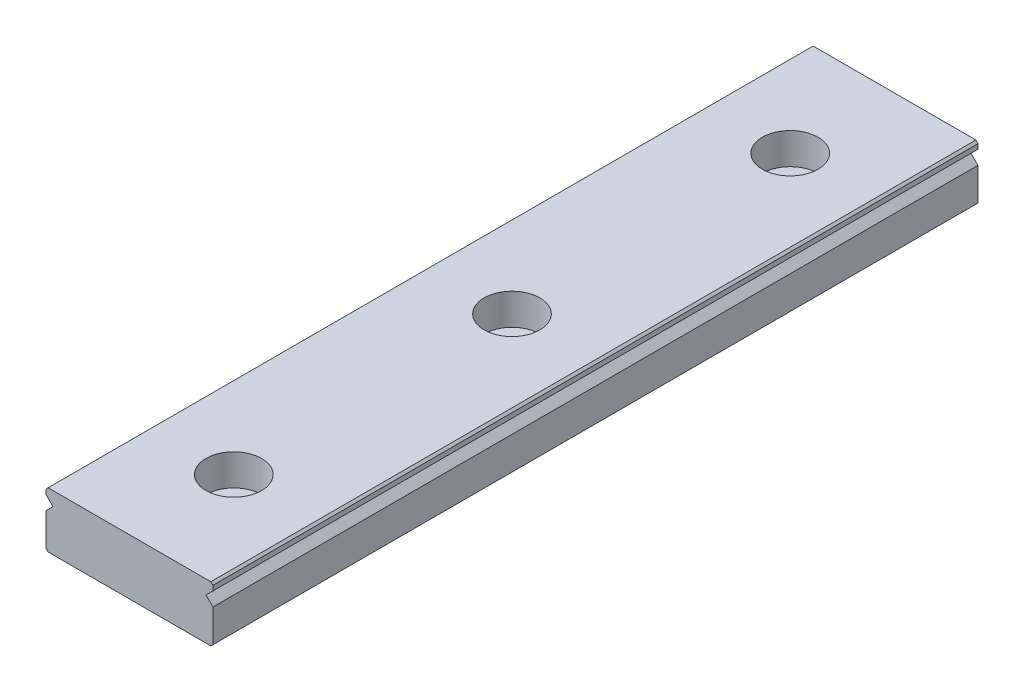
ISO-10303-21;
HEADER;
FILE_DESCRIPTION(('STEP AP214'),'2;1');
FILE_NAME('part.step','',(''),(''),'','','');
FILE_SCHEMA(('AUTOMOTIVE_DESIGN { 1 0 10303 214 1 1 1 1 }'));
ENDSEC;
DATA;
#1=APPLICATION_CONTEXT('core data for automotive mechanical design processes');
#2=APPLICATION_PROTOCOL_DEFINITION('international standard','automotive_design',2000,#1);
#3=PRODUCT_CONTEXT('',#1,'mechanical');
#4=PRODUCT('Part','Part','',(#3));
#5=PRODUCT_RELATED_PRODUCT_CATEGORY('part','',(#4));
#6=PRODUCT_DEFINITION_FORMATION('','',#4);
#7=PRODUCT_DEFINITION_CONTEXT('part definition',#1,'design');
#8=PRODUCT_DEFINITION('design','',#6,#7);
#9=PRODUCT_DEFINITION_SHAPE('','',#8);
#10=(LENGTH_UNIT() NAMED_UNIT(*) SI_UNIT(.MILLI.,.METRE.));
#11=(NAMED_UNIT(*) PLANE_ANGLE_UNIT() SI_UNIT($,.RADIAN.));
#12=(NAMED_UNIT(*) SI_UNIT($,.STERADIAN.) SOLID_ANGLE_UNIT());
#13=UNCERTAINTY_MEASURE_WITH_UNIT(LENGTH_MEASURE(1.E-05),#10,'distance_accuracy_value','');
#14=(GEOMETRIC_REPRESENTATION_CONTEXT(3) GLOBAL_UNCERTAINTY_ASSIGNED_CONTEXT((#13)) GLOBAL_UNIT_ASSIGNED_CONTEXT((#10,
#11,#12)) REPRESENTATION_CONTEXT('',''));
#15=CARTESIAN_POINT('',(0.,0.,0.));
#16=DIRECTION('',(0.,0.,1.));
#17=DIRECTION('',(1.,0.,0.));
#18=AXIS2_PLACEMENT_3D('',#15,#16,#17);
#19=CARTESIAN_POINT('',(12.,7.,110.));
#20=DIRECTION('',(-1.,0.,0.));
#21=DIRECTION('',(0.,0.,1.));
#22=AXIS2_PLACEMENT_3D('',#19,#20,#21);
#23=PLANE('',#22);
#24=DIRECTION('',(0.,0.,1.));
#25=VECTOR('',#24,1.);
#26=CARTESIAN_POINT('',(12.,7.7,110.));
#27=LINE('',#26,#25);
#28=CARTESIAN_POINT('',(12.,7.7,0.));
#29=VERTEX_POINT('',#28);
#30=CARTESIAN_POINT('',(12.,7.7,110.));
#31=VERTEX_POINT('',#30);
#32=EDGE_CURVE('E122',#29,#31,#27,.T.);
#33=ORIENTED_EDGE('',*,*,#32,.T.);
#34=DIRECTION('',(0.,1.,0.));
#35=VECTOR('',#34,1.);
#36=CARTESIAN_POINT('',(12.,7.,110.));
#37=LINE('',#36,#35);
#38=CARTESIAN_POINT('',(12.,7.,110.));
#39=VERTEX_POINT('',#38);
#40=EDGE_CURVE('E118',#39,#31,#37,.T.);
#41=ORIENTED_EDGE('',*,*,#40,.F.);
#42=DIRECTION('',(0.,0.,1.));
#43=VECTOR('',#42,1.);
#44=CARTESIAN_POINT('',(12.,7.,110.));
#45=LINE('',#44,#43);
#46=CARTESIAN_POINT('',(12.,7.,0.));
#47=VERTEX_POINT('',#46);
#48=EDGE_CURVE('E120',#39,#47,#45,.F.);
#49=ORIENTED_EDGE('',*,*,#48,.T.);
#50=DIRECTION('',(0.,1.,0.));
#51=VECTOR('',#50,1.);
#52=CARTESIAN_POINT('',(12.,7.,0.));
#53=LINE('',#52,#51);
#54=EDGE_CURVE('E112',#29,#47,#53,.F.);
#55=ORIENTED_EDGE('',*,*,#54,.F.);
#56=EDGE_LOOP('',(#33,#41,#49,#55));
#57=FACE_BOUND('',#56,.T.);
#58=ADVANCED_FACE('F17',(#57),#23,.F.);
#59=CARTESIAN_POINT('',(-12.,7.,110.));
#60=DIRECTION('',(1.,0.,0.));
#61=DIRECTION('',(0.,0.,-1.));
#62=AXIS2_PLACEMENT_3D('',#59,#60,#61);
#63=PLANE('',#62);
#64=DIRECTION('',(0.,0.,1.));
#65=VECTOR('',#64,1.);
#66=CARTESIAN_POINT('',(-12.,7.,110.));
#67=LINE('',#66,#65);
#68=CARTESIAN_POINT('',(-12.,7.,0.));
#69=VERTEX_POINT('',#68);
#70=CARTESIAN_POINT('',(-12.,7.,110.));
#71=VERTEX_POINT('',#70);
#72=EDGE_CURVE('E222',#69,#71,#67,.T.);
#73=ORIENTED_EDGE('',*,*,#72,.T.);
#74=DIRECTION('',(0.,1.,0.));
#75=VECTOR('',#74,1.);
#76=CARTESIAN_POINT('',(-12.,7.,110.));
#77=LINE('',#76,#75);
#78=CARTESIAN_POINT('',(-12.,7.7,110.));
#79=VERTEX_POINT('',#78);
#80=EDGE_CURVE('E140',#79,#71,#77,.F.);
#81=ORIENTED_EDGE('',*,*,#80,.F.);
#82=DIRECTION('',(0.,0.,1.));
#83=VECTOR('',#82,1.);
#84=CARTESIAN_POINT('',(-12.,7.7,110.));
#85=LINE('',#84,#83);
#86=CARTESIAN_POINT('',(-12.,7.7,0.));
#87=VERTEX_POINT('',#86);
#88=EDGE_CURVE('E207',#79,#87,#85,.F.);
#89=ORIENTED_EDGE('',*,*,#88,.T.);
#90=DIRECTION('',(0.,1.,0.));
#91=VECTOR('',#90,1.);
#92=CARTESIAN_POINT('',(-12.,7.,0.));
#93=LINE('',#92,#91);
#94=EDGE_CURVE('E138',#69,#87,#93,.T.);
#95=ORIENTED_EDGE('',*,*,#94,.F.);
#96=EDGE_LOOP('',(#73,#81,#89,#95));
#97=FACE_BOUND('',#96,.T.);
#98=ADVANCED_FACE('F282',(#97),#63,.F.);
#99=CARTESIAN_POINT('',(12.,7.,110.));
#100=DIRECTION('',(-0.707106781186548,0.707106781186547,0.));
#101=DIRECTION('',(-0.707106781186547,-0.707106781186548,0.));
#102=AXIS2_PLACEMENT_3D('',#99,#100,#101);
#103=PLANE('',#102);
#104=ORIENTED_EDGE('',*,*,#48,.F.);
#105=DIRECTION('',(-0.707106781186547,-0.707106781186548,0.));
#106=VECTOR('',#105,1.);
#107=CARTESIAN_POINT('',(12.,7.,110.));
#108=LINE('',#107,#106);
#109=CARTESIAN_POINT('',(11.,6.,110.));
#110=VERTEX_POINT('',#109);
#111=EDGE_CURVE('E130',#110,#39,#108,.F.);
#112=ORIENTED_EDGE('',*,*,#111,.F.);
#113=DIRECTION('',(0.,0.,1.));
#114=VECTOR('',#113,1.);
#115=CARTESIAN_POINT('',(11.,6.,110.));
#116=LINE('',#115,#114);
#117=CARTESIAN_POINT('',(11.,6.,0.));
#118=VERTEX_POINT('',#117);
#119=EDGE_CURVE('E202',#110,#118,#116,.F.);
#120=ORIENTED_EDGE('',*,*,#119,.T.);
#121=DIRECTION('',(-0.707106781186547,-0.707106781186548,0.));
#122=VECTOR('',#121,1.);
#123=CARTESIAN_POINT('',(12.,7.,0.));
#124=LINE('',#123,#122);
#125=EDGE_CURVE('E132',#47,#118,#124,.T.);
#126=ORIENTED_EDGE('',*,*,#125,.F.);
#127=EDGE_LOOP('',(#104,#112,#120,#126));
#128=FACE_BOUND('',#127,.T.);
#129=ADVANCED_FACE('F128',(#128),#103,.F.);
#130=CARTESIAN_POINT('',(-12.,7.,110.));
#131=DIRECTION('',(0.707106781186548,0.707106781186548,0.));
#132=DIRECTION('',(-0.707106781186548,0.707106781186548,0.));
#133=AXIS2_PLACEMENT_3D('',#130,#131,#132);
#134=PLANE('',#133);
#135=DIRECTION('',(0.,0.,1.));
#136=VECTOR('',#135,1.);
#137=CARTESIAN_POINT('',(-11.,6.,110.));
#138=LINE('',#137,#136);
#139=CARTESIAN_POINT('',(-11.,6.,0.));
#140=VERTEX_POINT('',#139);
#141=CARTESIAN_POINT('',(-11.,6.,110.));
#142=VERTEX_POINT('',#141);
#143=EDGE_CURVE('E193',#140,#142,#138,.T.);
#144=ORIENTED_EDGE('',*,*,#143,.T.);
#145=DIRECTION('',(-0.707106781186548,0.707106781186548,0.));
#146=VECTOR('',#145,1.);
#147=CARTESIAN_POINT('',(-12.,7.,110.));
#148=LINE('',#147,#146);
#149=EDGE_CURVE('E220',#71,#142,#148,.F.);
#150=ORIENTED_EDGE('',*,*,#149,.F.);
#151=ORIENTED_EDGE('',*,*,#72,.F.);
#152=DIRECTION('',(-0.707106781186548,0.707106781186548,0.));
#153=VECTOR('',#152,1.);
#154=CARTESIAN_POINT('',(-12.,7.,0.));
#155=LINE('',#154,#153);
#156=EDGE_CURVE('E218',#140,#69,#155,.T.);
#157=ORIENTED_EDGE('',*,*,#156,.F.);
#158=EDGE_LOOP('',(#144,#150,#151,#157));
#159=FACE_BOUND('',#158,.T.);
#160=ADVANCED_FACE('F285',(#159),#134,.F.);
#161=CARTESIAN_POINT('',(0.,8.,15.));
#162=DIRECTION('',(0.,1.,0.));
#163=DIRECTION('',(0.,0.,1.));
#164=AXIS2_PLACEMENT_3D('',#161,#162,#163);
#165=CYLINDRICAL_SURFACE('',#164,4.);
#166=CARTESIAN_POINT('',(0.,3.5,15.));
#167=DIRECTION('',(0.,1.,0.));
#168=DIRECTION('',(0.,0.,1.));
#169=AXIS2_PLACEMENT_3D('',#166,#167,#168);
#170=CIRCLE('',#169,4.);
#171=CARTESIAN_POINT('',(0.,3.5,19.));
#172=VERTEX_POINT('',#171);
#173=EDGE_CURVE('E20',#172,#172,#170,.F.);
#174=ORIENTED_EDGE('',*,*,#173,.T.);
#175=EDGE_LOOP('',(#174));
#176=FACE_BOUND('',#175,.T.);
#177=CARTESIAN_POINT('',(0.,8.,15.));
#178=DIRECTION('',(0.,1.,0.));
#179=DIRECTION('',(0.,0.,1.));
#180=AXIS2_PLACEMENT_3D('',#177,#178,#179);
#181=CIRCLE('',#180,4.);
#182=CARTESIAN_POINT('',(0.,8.,19.));
#183=VERTEX_POINT('',#182);
#184=EDGE_CURVE('E175',#183,#183,#181,.T.);
#185=ORIENTED_EDGE('',*,*,#184,.T.);
#186=EDGE_LOOP('',(#185));
#187=FACE_BOUND('',#186,.T.);
#188=ADVANCED_FACE('F490',(#176,#187),#165,.F.);
#189=CARTESIAN_POINT('',(1.39659334444375E-13,8.,55.));
#190=DIRECTION('',(0.,1.,0.));
#191=DIRECTION('',(0.,0.,1.));
#192=AXIS2_PLACEMENT_3D('',#189,#190,#191);
#193=CYLINDRICAL_SURFACE('',#192,4.);
#194=CARTESIAN_POINT('',(1.39659334444375E-13,3.5,55.));
#195=DIRECTION('',(0.,1.,0.));
#196=DIRECTION('',(0.,0.,1.));
#197=AXIS2_PLACEMENT_3D('',#194,#195,#196);
#198=CIRCLE('',#197,4.);
#199=CARTESIAN_POINT('',(1.39659334444375E-13,3.5,59.));
#200=VERTEX_POINT('',#199);
#201=EDGE_CURVE('E180',#200,#200,#198,.F.);
#202=ORIENTED_EDGE('',*,*,#201,.T.);
#203=EDGE_LOOP('',(#202));
#204=FACE_BOUND('',#203,.T.);
#205=CARTESIAN_POINT('',(1.39659334444375E-13,8.,55.));
#206=DIRECTION('',(0.,1.,0.));
#207=DIRECTION('',(0.,0.,1.));
#208=AXIS2_PLACEMENT_3D('',#205,#206,#207);
#209=CIRCLE('',#208,4.);
#210=CARTESIAN_POINT('',(1.39659334444375E-13,8.,59.));
#211=VERTEX_POINT('',#210);
#212=EDGE_CURVE('E172',#211,#211,#209,.T.);
#213=ORIENTED_EDGE('',*,*,#212,.T.);
#214=EDGE_LOOP('',(#213));
#215=FACE_BOUND('',#214,.T.);
#216=ADVANCED_FACE('F480',(#204,#215),#193,.F.);
#217=CARTESIAN_POINT('',(2.79318668888751E-13,8.,95.));
#218=DIRECTION('',(0.,1.,0.));
#219=DIRECTION('',(0.,0.,1.));
#220=AXIS2_PLACEMENT_3D('',#217,#218,#219);
#221=CYLINDRICAL_SURFACE('',#220,4.);
#222=CARTESIAN_POINT('',(2.79318668888751E-13,3.5,95.));
#223=DIRECTION('',(0.,1.,0.));
#224=DIRECTION('',(0.,0.,1.));
#225=AXIS2_PLACEMENT_3D('',#222,#223,#224);
#226=CIRCLE('',#225,4.);
#227=CARTESIAN_POINT('',(2.79318668888751E-13,3.5,99.));
#228=VERTEX_POINT('',#227);
#229=EDGE_CURVE('E178',#228,#228,#226,.F.);
#230=ORIENTED_EDGE('',*,*,#229,.T.);
#231=EDGE_LOOP('',(#230));
#232=FACE_BOUND('',#231,.T.);
#233=CARTESIAN_POINT('',(2.79318668888751E-13,8.,95.));
#234=DIRECTION('',(0.,1.,0.));
#235=DIRECTION('',(0.,0.,1.));
#236=AXIS2_PLACEMENT_3D('',#233,#234,#235);
#237=CIRCLE('',#236,4.);
#238=CARTESIAN_POINT('',(2.79318668888751E-13,8.,99.));
#239=VERTEX_POINT('',#238);
#240=EDGE_CURVE('E168',#239,#239,#237,.T.);
#241=ORIENTED_EDGE('',*,*,#240,.T.);
#242=EDGE_LOOP('',(#241));
#243=FACE_BOUND('',#242,.T.);
#244=ADVANCED_FACE('F471',(#232,#243),#221,.F.);
#245=CARTESIAN_POINT('',(11.7,8.,110.));
#246=DIRECTION('',(-0.707106781186548,-0.707106781186548,0.));
#247=DIRECTION('',(0.707106781186548,-0.707106781186548,0.));
#248=AXIS2_PLACEMENT_3D('',#245,#246,#247);
#249=PLANE('',#248);
#250=DIRECTION('',(0.,0.,-1.));
#251=VECTOR('',#250,1.);
#252=CARTESIAN_POINT('',(11.7,8.,110.));
#253=LINE('',#252,#251);
#254=CARTESIAN_POINT('',(11.7,8.,0.));
#255=VERTEX_POINT('',#254);
#256=CARTESIAN_POINT('',(11.7,8.,110.));
#257=VERTEX_POINT('',#256);
#258=EDGE_CURVE('E171',#255,#257,#253,.F.);
#259=ORIENTED_EDGE('',*,*,#258,.T.);
#260=DIRECTION('',(0.707106781186548,-0.707106781186548,0.));
#261=VECTOR('',#260,1.);
#262=CARTESIAN_POINT('',(11.7,8.,110.));
#263=LINE('',#262,#261);
#264=EDGE_CURVE('E215',#31,#257,#263,.F.);
#265=ORIENTED_EDGE('',*,*,#264,.F.);
#266=ORIENTED_EDGE('',*,*,#32,.F.);
#267=DIRECTION('',(0.707106781186548,-0.707106781186548,0.));
#268=VECTOR('',#267,1.);
#269=CARTESIAN_POINT('',(11.7,8.,0.));
#270=LINE('',#269,#268);
#271=EDGE_CURVE('E213',#255,#29,#270,.T.);
#272=ORIENTED_EDGE('',*,*,#271,.F.);
#273=EDGE_LOOP('',(#259,#265,#266,#272));
#274=FACE_BOUND('',#273,.T.);
#275=ADVANCED_FACE('F273',(#274),#249,.F.);
#276=CARTESIAN_POINT('',(-12.,7.7,110.));
#277=DIRECTION('',(0.707106781186548,-0.707106781186548,0.));
#278=DIRECTION('',(0.707106781186548,0.707106781186548,0.));
#279=AXIS2_PLACEMENT_3D('',#276,#277,#278);
#280=PLANE('',#279);
#281=ORIENTED_EDGE('',*,*,#88,.F.);
#282=DIRECTION('',(0.707106781186548,0.707106781186548,0.));
#283=VECTOR('',#282,1.);
#284=CARTESIAN_POINT('',(-12.,7.7,110.));
#285=LINE('',#284,#283);
#286=CARTESIAN_POINT('',(-11.7,8.,110.));
#287=VERTEX_POINT('',#286);
#288=EDGE_CURVE('E210',#287,#79,#285,.F.);
#289=ORIENTED_EDGE('',*,*,#288,.F.);
#290=DIRECTION('',(0.,0.,-1.));
#291=VECTOR('',#290,1.);
#292=CARTESIAN_POINT('',(-11.7,8.,110.));
#293=LINE('',#292,#291);
#294=CARTESIAN_POINT('',(-11.7,8.,0.));
#295=VERTEX_POINT('',#294);
#296=EDGE_CURVE('E233',#287,#295,#293,.T.);
#297=ORIENTED_EDGE('',*,*,#296,.T.);
#298=DIRECTION('',(0.707106781186548,0.707106781186548,0.));
#299=VECTOR('',#298,1.);
#300=CARTESIAN_POINT('',(-12.,7.7,0.));
#301=LINE('',#300,#299);
#302=EDGE_CURVE('E205',#87,#295,#301,.T.);
#303=ORIENTED_EDGE('',*,*,#302,.F.);
#304=EDGE_LOOP('',(#281,#289,#297,#303));
#305=FACE_BOUND('',#304,.T.);
#306=ADVANCED_FACE('F280',(#305),#280,.F.);
#307=CARTESIAN_POINT('',(11.,6.,110.));
#308=DIRECTION('',(-0.707106781186548,-0.707106781186548,0.));
#309=DIRECTION('',(0.707106781186548,-0.707106781186548,0.));
#310=AXIS2_PLACEMENT_3D('',#307,#308,#309);
#311=PLANE('',#310);
#312=ORIENTED_EDGE('',*,*,#119,.F.);
#313=DIRECTION('',(0.707106781186548,-0.707106781186548,0.));
#314=VECTOR('',#313,1.);
#315=CARTESIAN_POINT('',(11.,6.,110.));
#316=LINE('',#315,#314);
#317=CARTESIAN_POINT('',(12.,5.,110.));
#318=VERTEX_POINT('',#317);
#319=EDGE_CURVE('E137',#318,#110,#316,.F.);
#320=ORIENTED_EDGE('',*,*,#319,.F.);
#321=DIRECTION('',(0.,0.,1.));
#322=VECTOR('',#321,1.);
#323=CARTESIAN_POINT('',(12.,5.,110.));
#324=LINE('',#323,#322);
#325=CARTESIAN_POINT('',(12.,5.,0.));
#326=VERTEX_POINT('',#325);
#327=EDGE_CURVE('E230',#318,#326,#324,.F.);
#328=ORIENTED_EDGE('',*,*,#327,.T.);
#329=DIRECTION('',(0.707106781186548,-0.707106781186548,0.));
#330=VECTOR('',#329,1.);
#331=CARTESIAN_POINT('',(11.,6.,0.));
#332=LINE('',#331,#330);
#333=EDGE_CURVE('E200',#118,#326,#332,.T.);
#334=ORIENTED_EDGE('',*,*,#333,.F.);
#335=EDGE_LOOP('',(#312,#320,#328,#334));
#336=FACE_BOUND('',#335,.T.);
#337=ADVANCED_FACE('F228',(#336),#311,.F.);
#338=CARTESIAN_POINT('',(-11.,6.,110.));
#339=DIRECTION('',(0.707106781186548,-0.707106781186547,0.));
#340=DIRECTION('',(0.707106781186547,0.707106781186548,0.));
#341=AXIS2_PLACEMENT_3D('',#338,#339,#340);
#342=PLANE('',#341);
#343=DIRECTION('',(0.,0.,-1.));
#344=VECTOR('',#343,1.);
#345=CARTESIAN_POINT('',(-12.,5.,110.));
#346=LINE('',#345,#344);
#347=CARTESIAN_POINT('',(-12.,5.,0.));
#348=VERTEX_POINT('',#347);
#349=CARTESIAN_POINT('',(-12.,5.,110.));
#350=VERTEX_POINT('',#349);
#351=EDGE_CURVE('E167',#348,#350,#346,.F.);
#352=ORIENTED_EDGE('',*,*,#351,.T.);
#353=DIRECTION('',(0.707106781186547,0.707106781186548,0.));
#354=VECTOR('',#353,1.);
#355=CARTESIAN_POINT('',(-11.,6.,110.));
#356=LINE('',#355,#354);
#357=EDGE_CURVE('E189',#142,#350,#356,.F.);
#358=ORIENTED_EDGE('',*,*,#357,.F.);
#359=ORIENTED_EDGE('',*,*,#143,.F.);
#360=DIRECTION('',(0.707106781186547,0.707106781186548,0.));
#361=VECTOR('',#360,1.);
#362=CARTESIAN_POINT('',(-11.,6.,0.));
#363=LINE('',#362,#361);
#364=EDGE_CURVE('E185',#348,#140,#363,.T.);
#365=ORIENTED_EDGE('',*,*,#364,.F.);
#366=EDGE_LOOP('',(#352,#358,#359,#365));
#367=FACE_BOUND('',#366,.T.);
#368=ADVANCED_FACE('F290',(#367),#342,.F.);
#369=CARTESIAN_POINT('',(2.25,3.5,15.));
#370=DIRECTION('',(0.,-1.,0.));
#371=DIRECTION('',(0.,0.,-1.));
#372=AXIS2_PLACEMENT_3D('',#369,#370,#371);
#373=PLANE('',#372);
#374=ORIENTED_EDGE('',*,*,#173,.F.);
#375=EDGE_LOOP('',(#374));
#376=FACE_BOUND('',#375,.T.);
#377=CARTESIAN_POINT('',(0.,3.5,15.));
#378=DIRECTION('',(0.,1.,0.));
#379=DIRECTION('',(0.,0.,1.));
#380=AXIS2_PLACEMENT_3D('',#377,#378,#379);
#381=CIRCLE('',#380,2.25);
#382=CARTESIAN_POINT('',(0.,3.5,17.25));
#383=VERTEX_POINT('',#382);
#384=EDGE_CURVE('E164',#383,#383,#381,.F.);
#385=ORIENTED_EDGE('',*,*,#384,.T.);
#386=EDGE_LOOP('',(#385));
#387=FACE_BOUND('',#386,.T.);
#388=ADVANCED_FACE('F428',(#376,#387),#373,.F.);
#389=CARTESIAN_POINT('',(2.25000000000014,3.5,55.));
#390=DIRECTION('',(0.,-1.,0.));
#391=DIRECTION('',(0.,0.,-1.));
#392=AXIS2_PLACEMENT_3D('',#389,#390,#391);
#393=PLANE('',#392);
#394=ORIENTED_EDGE('',*,*,#201,.F.);
#395=EDGE_LOOP('',(#394));
#396=FACE_BOUND('',#395,.T.);
#397=CARTESIAN_POINT('',(1.39659334444375E-13,3.5,55.));
#398=DIRECTION('',(0.,1.,0.));
#399=DIRECTION('',(0.,0.,1.));
#400=AXIS2_PLACEMENT_3D('',#397,#398,#399);
#401=CIRCLE('',#400,2.25);
#402=CARTESIAN_POINT('',(1.39659334444375E-13,3.5,57.25));
#403=VERTEX_POINT('',#402);
#404=EDGE_CURVE('E161',#403,#403,#401,.F.);
#405=ORIENTED_EDGE('',*,*,#404,.T.);
#406=EDGE_LOOP('',(#405));
#407=FACE_BOUND('',#406,.T.);
#408=ADVANCED_FACE('F418',(#396,#407),#393,.F.);
#409=CARTESIAN_POINT('',(2.25000000000028,3.5,95.));
#410=DIRECTION('',(0.,-1.,0.));
#411=DIRECTION('',(0.,0.,-1.));
#412=AXIS2_PLACEMENT_3D('',#409,#410,#411);
#413=PLANE('',#412);
#414=ORIENTED_EDGE('',*,*,#229,.F.);
#415=EDGE_LOOP('',(#414));
#416=FACE_BOUND('',#415,.T.);
#417=CARTESIAN_POINT('',(2.79318668888751E-13,3.5,95.));
#418=DIRECTION('',(0.,1.,0.));
#419=DIRECTION('',(0.,0.,1.));
#420=AXIS2_PLACEMENT_3D('',#417,#418,#419);
#421=CIRCLE('',#420,2.25);
#422=CARTESIAN_POINT('',(2.79318668888751E-13,3.5,97.25));
#423=VERTEX_POINT('',#422);
#424=EDGE_CURVE('E157',#423,#423,#421,.F.);
#425=ORIENTED_EDGE('',*,*,#424,.T.);
#426=EDGE_LOOP('',(#425));
#427=FACE_BOUND('',#426,.T.);
#428=ADVANCED_FACE('F409',(#416,#427),#413,.F.);
#429=CARTESIAN_POINT('',(-11.7,8.,110.));
#430=DIRECTION('',(0.,-1.,0.));
#431=DIRECTION('',(0.,0.,-1.));
#432=AXIS2_PLACEMENT_3D('',#429,#430,#431);
#433=PLANE('',#432);
#434=ORIENTED_EDGE('',*,*,#296,.F.);
#435=DIRECTION('',(-1.,0.,0.));
#436=VECTOR('',#435,1.);
#437=CARTESIAN_POINT('',(-12.,8.,110.));
#438=LINE('',#437,#436);
#439=EDGE_CURVE('E260',#287,#257,#438,.F.);
#440=ORIENTED_EDGE('',*,*,#439,.T.);
#441=ORIENTED_EDGE('',*,*,#258,.F.);
#442=DIRECTION('',(-1.,0.,0.));
#443=VECTOR('',#442,1.);
#444=CARTESIAN_POINT('',(-12.,8.,0.));
#445=LINE('',#444,#443);
#446=EDGE_CURVE('E240',#295,#255,#445,.F.);
#447=ORIENTED_EDGE('',*,*,#446,.F.);
#448=EDGE_LOOP('',(#434,#440,#441,#447));
#449=FACE_BOUND('',#448,.T.);
#450=ORIENTED_EDGE('',*,*,#240,.F.);
#451=EDGE_LOOP('',(#450));
#452=FACE_BOUND('',#451,.T.);
#453=ORIENTED_EDGE('',*,*,#212,.F.);
#454=EDGE_LOOP('',(#453));
#455=FACE_BOUND('',#454,.T.);
#456=ORIENTED_EDGE('',*,*,#184,.F.);
#457=EDGE_LOOP('',(#456));
#458=FACE_BOUND('',#457,.T.);
#459=ADVANCED_FACE('F276',(#449,#452,#455,#458),#433,.F.);
#460=CARTESIAN_POINT('',(12.,0.3,110.));
#461=DIRECTION('',(-1.,0.,0.));
#462=DIRECTION('',(0.,0.,1.));
#463=AXIS2_PLACEMENT_3D('',#460,#461,#462);
#464=PLANE('',#463);
#465=ORIENTED_EDGE('',*,*,#327,.F.);
#466=DIRECTION('',(0.,1.,0.));
#467=VECTOR('',#466,1.);
#468=CARTESIAN_POINT('',(12.,8.,110.));
#469=LINE('',#468,#467);
#470=CARTESIAN_POINT('',(12.,0.3,110.));
#471=VERTEX_POINT('',#470);
#472=EDGE_CURVE('E258',#318,#471,#469,.F.);
#473=ORIENTED_EDGE('',*,*,#472,.T.);
#474=DIRECTION('',(0.,0.,1.));
#475=VECTOR('',#474,1.);
#476=CARTESIAN_POINT('',(12.,0.299999999999999,110.));
#477=LINE('',#476,#475);
#478=CARTESIAN_POINT('',(12.,0.3,0.));
#479=VERTEX_POINT('',#478);
#480=EDGE_CURVE('E239',#471,#479,#477,.F.);
#481=ORIENTED_EDGE('',*,*,#480,.T.);
#482=DIRECTION('',(0.,1.,0.));
#483=VECTOR('',#482,1.);
#484=CARTESIAN_POINT('',(12.,8.,0.));
#485=LINE('',#484,#483);
#486=EDGE_CURVE('E236',#326,#479,#485,.F.);
#487=ORIENTED_EDGE('',*,*,#486,.F.);
#488=EDGE_LOOP('',(#465,#473,#481,#487));
#489=FACE_BOUND('',#488,.T.);
#490=ADVANCED_FACE('F237',(#489),#464,.F.);
#491=CARTESIAN_POINT('',(-12.,0.3,110.));
#492=DIRECTION('',(1.,0.,0.));
#493=DIRECTION('',(0.,0.,-1.));
#494=AXIS2_PLACEMENT_3D('',#491,#492,#493);
#495=PLANE('',#494);
#496=DIRECTION('',(0.,0.,1.));
#497=VECTOR('',#496,1.);
#498=CARTESIAN_POINT('',(-12.,0.3,110.));
#499=LINE('',#498,#497);
#500=CARTESIAN_POINT('',(-12.,0.3,0.));
#501=VERTEX_POINT('',#500);
#502=CARTESIAN_POINT('',(-12.,0.3,110.));
#503=VERTEX_POINT('',#502);
#504=EDGE_CURVE('E160',#501,#503,#499,.T.);
#505=ORIENTED_EDGE('',*,*,#504,.T.);
#506=DIRECTION('',(0.,1.,0.));
#507=VECTOR('',#506,1.);
#508=CARTESIAN_POINT('',(-12.,8.,110.));
#509=LINE('',#508,#507);
#510=EDGE_CURVE('E252',#503,#350,#509,.T.);
#511=ORIENTED_EDGE('',*,*,#510,.T.);
#512=ORIENTED_EDGE('',*,*,#351,.F.);
#513=DIRECTION('',(0.,1.,0.));
#514=VECTOR('',#513,1.);
#515=CARTESIAN_POINT('',(-12.,8.,0.));
#516=LINE('',#515,#514);
#517=EDGE_CURVE('E156',#501,#348,#516,.T.);
#518=ORIENTED_EDGE('',*,*,#517,.F.);
#519=EDGE_LOOP('',(#505,#511,#512,#518));
#520=FACE_BOUND('',#519,.T.);
#521=ADVANCED_FACE('F294',(#520),#495,.F.);
#522=CARTESIAN_POINT('',(0.,8.,15.));
#523=DIRECTION('',(0.,1.,0.));
#524=DIRECTION('',(0.,0.,1.));
#525=AXIS2_PLACEMENT_3D('',#522,#523,#524);
#526=CYLINDRICAL_SURFACE('',#525,2.25);
#527=CARTESIAN_POINT('',(0.,0.,15.));
#528=DIRECTION('',(0.,1.,0.));
#529=DIRECTION('',(0.,0.,1.));
#530=AXIS2_PLACEMENT_3D('',#527,#528,#529);
#531=CIRCLE('',#530,2.25);
#532=CARTESIAN_POINT('',(0.,0.,17.25));
#533=VERTEX_POINT('',#532);
#534=EDGE_CURVE('E153',#533,#533,#531,.F.);
#535=ORIENTED_EDGE('',*,*,#534,.T.);
#536=EDGE_LOOP('',(#535));
#537=FACE_BOUND('',#536,.T.);
#538=ORIENTED_EDGE('',*,*,#384,.F.);
#539=EDGE_LOOP('',(#538));
#540=FACE_BOUND('',#539,.T.);
#541=ADVANCED_FACE('F374',(#537,#540),#526,.F.);
#542=CARTESIAN_POINT('',(1.39659334444375E-13,8.,55.));
#543=DIRECTION('',(0.,1.,0.));
#544=DIRECTION('',(0.,0.,1.));
#545=AXIS2_PLACEMENT_3D('',#542,#543,#544);
#546=CYLINDRICAL_SURFACE('',#545,2.25);
#547=CARTESIAN_POINT('',(1.39659334444375E-13,0.,55.));
#548=DIRECTION('',(0.,1.,0.));
#549=DIRECTION('',(0.,0.,1.));
#550=AXIS2_PLACEMENT_3D('',#547,#548,#549);
#551=CIRCLE('',#550,2.25);
#552=CARTESIAN_POINT('',(1.39659334444375E-13,0.,57.25));
#553=VERTEX_POINT('',#552);
#554=EDGE_CURVE('E150',#553,#553,#551,.F.);
#555=ORIENTED_EDGE('',*,*,#554,.T.);
#556=EDGE_LOOP('',(#555));
#557=FACE_BOUND('',#556,.T.);
#558=ORIENTED_EDGE('',*,*,#404,.F.);
#559=EDGE_LOOP('',(#558));
#560=FACE_BOUND('',#559,.T.);
#561=ADVANCED_FACE('F364',(#557,#560),#546,.F.);
#562=CARTESIAN_POINT('',(2.79318668888751E-13,8.,95.));
#563=DIRECTION('',(0.,1.,0.));
#564=DIRECTION('',(0.,0.,1.));
#565=AXIS2_PLACEMENT_3D('',#562,#563,#564);
#566=CYLINDRICAL_SURFACE('',#565,2.25);
#567=CARTESIAN_POINT('',(2.79318668888751E-13,0.,95.));
#568=DIRECTION('',(0.,1.,0.));
#569=DIRECTION('',(0.,0.,1.));
#570=AXIS2_PLACEMENT_3D('',#567,#568,#569);
#571=CIRCLE('',#570,2.25);
#572=CARTESIAN_POINT('',(2.79318668888751E-13,0.,97.25));
#573=VERTEX_POINT('',#572);
#574=EDGE_CURVE('E146',#573,#573,#571,.F.);
#575=ORIENTED_EDGE('',*,*,#574,.T.);
#576=EDGE_LOOP('',(#575));
#577=FACE_BOUND('',#576,.T.);
#578=ORIENTED_EDGE('',*,*,#424,.F.);
#579=EDGE_LOOP('',(#578));
#580=FACE_BOUND('',#579,.T.);
#581=ADVANCED_FACE('F355',(#577,#580),#566,.F.);
#582=CARTESIAN_POINT('',(-12.,0.3,110.));
#583=DIRECTION('',(0.707106781186548,0.707106781186547,0.));
#584=DIRECTION('',(-0.707106781186547,0.707106781186548,0.));
#585=AXIS2_PLACEMENT_3D('',#582,#583,#584);
#586=PLANE('',#585);
#587=DIRECTION('',(0.,0.,1.));
#588=VECTOR('',#587,1.);
#589=CARTESIAN_POINT('',(-11.7,0.,110.));
#590=LINE('',#589,#588);
#591=CARTESIAN_POINT('',(-11.7,0.,0.));
#592=VERTEX_POINT('',#591);
#593=CARTESIAN_POINT('',(-11.7,0.,110.));
#594=VERTEX_POINT('',#593);
#595=EDGE_CURVE('E149',#592,#594,#590,.T.);
#596=ORIENTED_EDGE('',*,*,#595,.T.);
#597=DIRECTION('',(-0.707106781186545,0.70710678118655,0.));
#598=VECTOR('',#597,1.);
#599=CARTESIAN_POINT('',(-11.7,0.,110.));
#600=LINE('',#599,#598);
#601=EDGE_CURVE('E255',#594,#503,#600,.T.);
#602=ORIENTED_EDGE('',*,*,#601,.T.);
#603=ORIENTED_EDGE('',*,*,#504,.F.);
#604=DIRECTION('',(-0.707106781186545,0.70710678118655,0.));
#605=VECTOR('',#604,1.);
#606=CARTESIAN_POINT('',(-11.7,0.,0.));
#607=LINE('',#606,#605);
#608=EDGE_CURVE('E242',#592,#501,#607,.T.);
#609=ORIENTED_EDGE('',*,*,#608,.F.);
#610=EDGE_LOOP('',(#596,#602,#603,#609));
#611=FACE_BOUND('',#610,.T.);
#612=ADVANCED_FACE('F299',(#611),#586,.F.);
#613=CARTESIAN_POINT('',(-12.,8.,110.));
#614=DIRECTION('',(0.,0.,-1.));
#615=DIRECTION('',(-1.,0.,0.));
#616=AXIS2_PLACEMENT_3D('',#613,#614,#615);
#617=PLANE('',#616);
#618=ORIENTED_EDGE('',*,*,#149,.T.);
#619=ORIENTED_EDGE('',*,*,#357,.T.);
#620=ORIENTED_EDGE('',*,*,#510,.F.);
#621=ORIENTED_EDGE('',*,*,#601,.F.);
#622=DIRECTION('',(1.,0.,0.));
#623=VECTOR('',#622,1.);
#624=CARTESIAN_POINT('',(-11.7,0.,110.));
#625=LINE('',#624,#623);
#626=CARTESIAN_POINT('',(11.7,0.,110.));
#627=VERTEX_POINT('',#626);
#628=EDGE_CURVE('E303',#594,#627,#625,.T.);
#629=ORIENTED_EDGE('',*,*,#628,.T.);
#630=DIRECTION('',(-0.707106781186547,-0.707106781186548,0.));
#631=VECTOR('',#630,1.);
#632=CARTESIAN_POINT('',(11.7,0.,110.));
#633=LINE('',#632,#631);
#634=EDGE_CURVE('E249',#627,#471,#633,.F.);
#635=ORIENTED_EDGE('',*,*,#634,.T.);
#636=ORIENTED_EDGE('',*,*,#472,.F.);
#637=ORIENTED_EDGE('',*,*,#319,.T.);
#638=ORIENTED_EDGE('',*,*,#111,.T.);
#639=ORIENTED_EDGE('',*,*,#40,.T.);
#640=ORIENTED_EDGE('',*,*,#264,.T.);
#641=ORIENTED_EDGE('',*,*,#439,.F.);
#642=ORIENTED_EDGE('',*,*,#288,.T.);
#643=ORIENTED_EDGE('',*,*,#80,.T.);
#644=EDGE_LOOP('',(#618,#619,#620,#621,#629,#635,#636,#637,#638,#639,#640,#641,#642,#643));
#645=FACE_BOUND('',#644,.T.);
#646=ADVANCED_FACE('F135',(#645),#617,.F.);
#647=CARTESIAN_POINT('',(11.7,0.,110.));
#648=DIRECTION('',(-0.707106781186548,0.707106781186547,0.));
#649=DIRECTION('',(-0.707106781186547,-0.707106781186548,0.));
#650=AXIS2_PLACEMENT_3D('',#647,#648,#649);
#651=PLANE('',#650);
#652=ORIENTED_EDGE('',*,*,#480,.F.);
#653=ORIENTED_EDGE('',*,*,#634,.F.);
#654=DIRECTION('',(0.,0.,1.));
#655=VECTOR('',#654,1.);
#656=CARTESIAN_POINT('',(11.7,0.,110.));
#657=LINE('',#656,#655);
#658=CARTESIAN_POINT('',(11.7,0.,0.));
#659=VERTEX_POINT('',#658);
#660=EDGE_CURVE('E26',#627,#659,#657,.F.);
#661=ORIENTED_EDGE('',*,*,#660,.T.);
#662=DIRECTION('',(-0.707106781186545,-0.70710678118655,0.));
#663=VECTOR('',#662,1.);
#664=CARTESIAN_POINT('',(12.,0.3,0.));
#665=LINE('',#664,#663);
#666=EDGE_CURVE('E34',#479,#659,#665,.T.);
#667=ORIENTED_EDGE('',*,*,#666,.F.);
#668=EDGE_LOOP('',(#652,#653,#661,#667));
#669=FACE_BOUND('',#668,.T.);
#670=ADVANCED_FACE('F313',(#669),#651,.F.);
#671=CARTESIAN_POINT('',(-12.,8.,0.));
#672=DIRECTION('',(0.,0.,-1.));
#673=DIRECTION('',(-1.,0.,0.));
#674=AXIS2_PLACEMENT_3D('',#671,#672,#673);
#675=PLANE('',#674);
#676=ORIENTED_EDGE('',*,*,#364,.T.);
#677=ORIENTED_EDGE('',*,*,#156,.T.);
#678=ORIENTED_EDGE('',*,*,#94,.T.);
#679=ORIENTED_EDGE('',*,*,#302,.T.);
#680=ORIENTED_EDGE('',*,*,#446,.T.);
#681=ORIENTED_EDGE('',*,*,#271,.T.);
#682=ORIENTED_EDGE('',*,*,#54,.T.);
#683=ORIENTED_EDGE('',*,*,#125,.T.);
#684=ORIENTED_EDGE('',*,*,#333,.T.);
#685=ORIENTED_EDGE('',*,*,#486,.T.);
#686=ORIENTED_EDGE('',*,*,#666,.T.);
#687=DIRECTION('',(1.,0.,0.));
#688=VECTOR('',#687,1.);
#689=CARTESIAN_POINT('',(-11.7,0.,0.));
#690=LINE('',#689,#688);
#691=EDGE_CURVE('E11',#659,#592,#690,.F.);
#692=ORIENTED_EDGE('',*,*,#691,.T.);
#693=ORIENTED_EDGE('',*,*,#608,.T.);
#694=ORIENTED_EDGE('',*,*,#517,.T.);
#695=EDGE_LOOP('',(#676,#677,#678,#679,#680,#681,#682,#683,#684,#685,#686,#692,#693,#694));
#696=FACE_BOUND('',#695,.T.);
#697=ADVANCED_FACE('F225',(#696),#675,.T.);
#698=CARTESIAN_POINT('',(-11.7,0.,110.));
#699=DIRECTION('',(0.,1.,0.));
#700=DIRECTION('',(0.,0.,1.));
#701=AXIS2_PLACEMENT_3D('',#698,#699,#700);
#702=PLANE('',#701);
#703=ORIENTED_EDGE('',*,*,#660,.F.);
#704=ORIENTED_EDGE('',*,*,#628,.F.);
#705=ORIENTED_EDGE('',*,*,#595,.F.);
#706=ORIENTED_EDGE('',*,*,#691,.F.);
#707=EDGE_LOOP('',(#703,#704,#705,#706));
#708=FACE_BOUND('',#707,.T.);
#709=ORIENTED_EDGE('',*,*,#574,.F.);
#710=EDGE_LOOP('',(#709));
#711=FACE_BOUND('',#710,.T.);
#712=ORIENTED_EDGE('',*,*,#554,.F.);
#713=EDGE_LOOP('',(#712));
#714=FACE_BOUND('',#713,.T.);
#715=ORIENTED_EDGE('',*,*,#534,.F.);
#716=EDGE_LOOP('',(#715));
#717=FACE_BOUND('',#716,.T.);
#718=ADVANCED_FACE('F310',(#708,#711,#714,#717),#702,.F.);
#719=CLOSED_SHELL('',(#58,#98,#129,#160,#188,#216,#244,#275,#306,#337,#368,#388,#408,#428,#459,
#490,#521,#541,#561,#581,#612,#646,#670,#697,#718));
#720=MANIFOLD_SOLID_BREP('B1',#719);
#721=ADVANCED_BREP_SHAPE_REPRESENTATION('',(#18,#720),#14);
#722=SHAPE_DEFINITION_REPRESENTATION(#9,#721);
ENDSEC;
END-ISO-10303-21;
